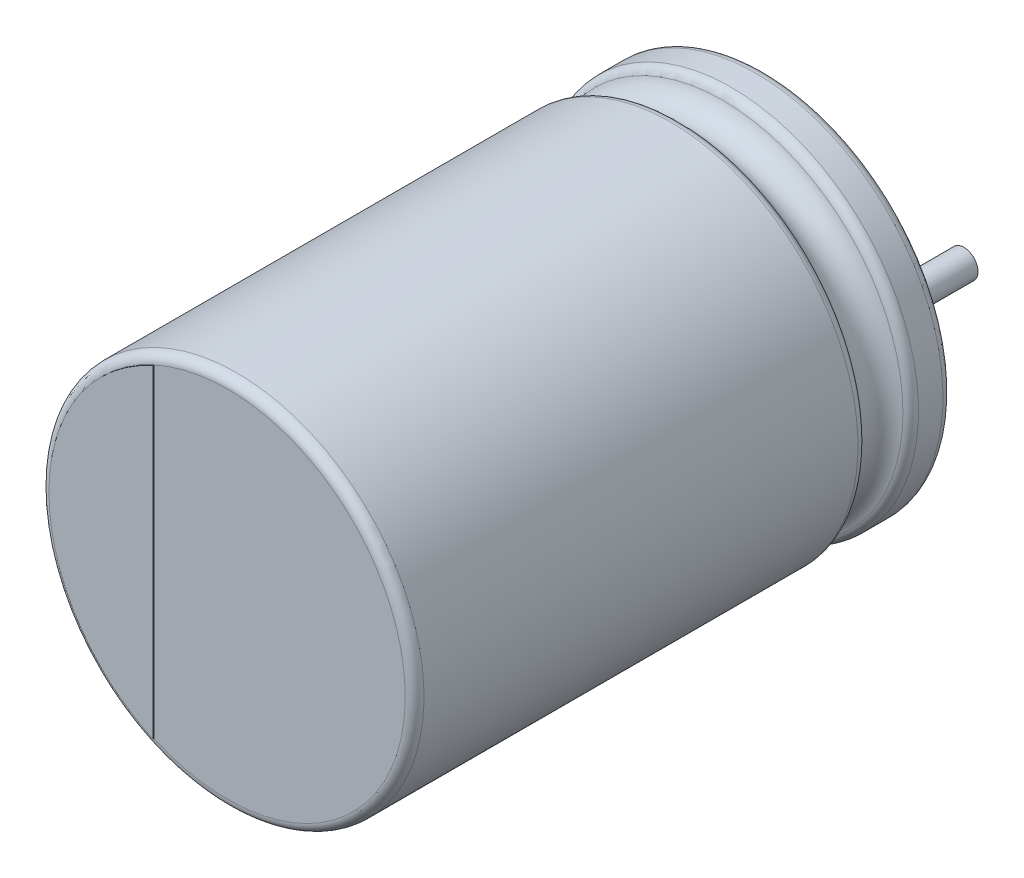
ISO-10303-21;
HEADER;
FILE_DESCRIPTION(('STEP AP214'),'2;1');
FILE_NAME('part.step','',(''),(''),'','','');
FILE_SCHEMA(('AUTOMOTIVE_DESIGN { 1 0 10303 214 1 1 1 1 }'));
ENDSEC;
DATA;
#1=APPLICATION_CONTEXT('core data for automotive mechanical design processes');
#2=APPLICATION_PROTOCOL_DEFINITION('international standard','automotive_design',2000,#1);
#3=PRODUCT_CONTEXT('',#1,'mechanical');
#4=PRODUCT('Part','Part','',(#3));
#5=PRODUCT_RELATED_PRODUCT_CATEGORY('part','',(#4));
#6=PRODUCT_DEFINITION_FORMATION('','',#4);
#7=PRODUCT_DEFINITION_CONTEXT('part definition',#1,'design');
#8=PRODUCT_DEFINITION('design','',#6,#7);
#9=PRODUCT_DEFINITION_SHAPE('','',#8);
#10=(LENGTH_UNIT() NAMED_UNIT(*) SI_UNIT(.MILLI.,.METRE.));
#11=(NAMED_UNIT(*) PLANE_ANGLE_UNIT() SI_UNIT($,.RADIAN.));
#12=(NAMED_UNIT(*) SI_UNIT($,.STERADIAN.) SOLID_ANGLE_UNIT());
#13=UNCERTAINTY_MEASURE_WITH_UNIT(LENGTH_MEASURE(1.E-05),#10,'distance_accuracy_value','');
#14=(GEOMETRIC_REPRESENTATION_CONTEXT(3) GLOBAL_UNCERTAINTY_ASSIGNED_CONTEXT((#13)) GLOBAL_UNIT_ASSIGNED_CONTEXT((#10,
#11,#12)) REPRESENTATION_CONTEXT('',''));
#15=CARTESIAN_POINT('',(0.,0.,0.));
#16=DIRECTION('',(0.,0.,1.));
#17=DIRECTION('',(1.,0.,0.));
#18=AXIS2_PLACEMENT_3D('',#15,#16,#17);
#19=CARTESIAN_POINT('',(-1.75,0.,-2.5));
#20=DIRECTION('',(0.,0.,1.));
#21=DIRECTION('',(1.,0.,0.));
#22=AXIS2_PLACEMENT_3D('',#19,#20,#21);
#23=CYLINDRICAL_SURFACE('',#22,0.3);
#24=CARTESIAN_POINT('',(-1.75,0.,-2.5));
#25=DIRECTION('',(0.,0.,1.));
#26=DIRECTION('',(-1.,0.,0.));
#27=AXIS2_PLACEMENT_3D('',#24,#25,#26);
#28=CIRCLE('',#27,0.3);
#29=CARTESIAN_POINT('',(-2.05,0.,-2.5));
#30=VERTEX_POINT('',#29);
#31=EDGE_CURVE('P0_E10',#30,#30,#28,.T.);
#32=ORIENTED_EDGE('',*,*,#31,.T.);
#33=EDGE_LOOP('',(#32));
#34=FACE_BOUND('',#33,.T.);
#35=CARTESIAN_POINT('',(-1.75,0.,0.));
#36=DIRECTION('',(0.,0.,1.));
#37=DIRECTION('',(-1.,0.,0.));
#38=AXIS2_PLACEMENT_3D('',#35,#36,#37);
#39=CIRCLE('',#38,0.3);
#40=CARTESIAN_POINT('',(-2.05,0.,0.));
#41=VERTEX_POINT('',#40);
#42=EDGE_CURVE('P0_E18',#41,#41,#39,.T.);
#43=ORIENTED_EDGE('',*,*,#42,.F.);
#44=EDGE_LOOP('',(#43));
#45=FACE_BOUND('',#44,.T.);
#46=ADVANCED_FACE('P0_F15',(#34,#45),#23,.T.);
#47=CARTESIAN_POINT('',(-1.75,0.,-2.5));
#48=DIRECTION('',(0.,0.,-1.));
#49=DIRECTION('',(-1.,0.,0.));
#50=AXIS2_PLACEMENT_3D('',#47,#48,#49);
#51=PLANE('',#50);
#52=ORIENTED_EDGE('',*,*,#31,.F.);
#53=EDGE_LOOP('',(#52));
#54=FACE_BOUND('',#53,.T.);
#55=ADVANCED_FACE('P0_F30',(#54),#51,.T.);
#56=CARTESIAN_POINT('',(-1.75,0.,0.));
#57=DIRECTION('',(0.,0.,-1.));
#58=DIRECTION('',(-1.,0.,0.));
#59=AXIS2_PLACEMENT_3D('',#56,#57,#58);
#60=PLANE('',#59);
#61=ORIENTED_EDGE('',*,*,#42,.T.);
#62=EDGE_LOOP('',(#61));
#63=FACE_BOUND('',#62,.T.);
#64=ADVANCED_FACE('P0_F27',(#63),#60,.F.);
#65=CLOSED_SHELL('',(#46,#55,#64));
#66=MANIFOLD_SOLID_BREP('P0_B1',#65);
#67=CARTESIAN_POINT('',(1.75,0.,-2.5));
#68=DIRECTION('',(0.,0.,1.));
#69=DIRECTION('',(1.,0.,0.));
#70=AXIS2_PLACEMENT_3D('',#67,#68,#69);
#71=CYLINDRICAL_SURFACE('',#70,0.300000000000001);
#72=CARTESIAN_POINT('',(1.75,0.,-2.5));
#73=DIRECTION('',(0.,0.,1.));
#74=DIRECTION('',(1.,0.,0.));
#75=AXIS2_PLACEMENT_3D('',#72,#73,#74);
#76=CIRCLE('',#75,0.300000000000001);
#77=CARTESIAN_POINT('',(2.05,0.,-2.5));
#78=VERTEX_POINT('',#77);
#79=EDGE_CURVE('P1_E10',#78,#78,#76,.T.);
#80=ORIENTED_EDGE('',*,*,#79,.T.);
#81=EDGE_LOOP('',(#80));
#82=FACE_BOUND('',#81,.T.);
#83=CARTESIAN_POINT('',(1.75,0.,0.));
#84=DIRECTION('',(0.,0.,1.));
#85=DIRECTION('',(1.,0.,0.));
#86=AXIS2_PLACEMENT_3D('',#83,#84,#85);
#87=CIRCLE('',#86,0.300000000000001);
#88=CARTESIAN_POINT('',(2.05,0.,0.));
#89=VERTEX_POINT('',#88);
#90=EDGE_CURVE('P1_E18',#89,#89,#87,.T.);
#91=ORIENTED_EDGE('',*,*,#90,.F.);
#92=EDGE_LOOP('',(#91));
#93=FACE_BOUND('',#92,.T.);
#94=ADVANCED_FACE('P1_F15',(#82,#93),#71,.T.);
#95=CARTESIAN_POINT('',(1.75,0.,-2.5));
#96=DIRECTION('',(0.,0.,1.));
#97=DIRECTION('',(1.,0.,0.));
#98=AXIS2_PLACEMENT_3D('',#95,#96,#97);
#99=PLANE('',#98);
#100=ORIENTED_EDGE('',*,*,#79,.F.);
#101=EDGE_LOOP('',(#100));
#102=FACE_BOUND('',#101,.T.);
#103=ADVANCED_FACE('P1_F30',(#102),#99,.F.);
#104=CARTESIAN_POINT('',(1.75,0.,0.));
#105=DIRECTION('',(0.,0.,1.));
#106=DIRECTION('',(1.,0.,0.));
#107=AXIS2_PLACEMENT_3D('',#104,#105,#106);
#108=PLANE('',#107);
#109=ORIENTED_EDGE('',*,*,#90,.T.);
#110=EDGE_LOOP('',(#109));
#111=FACE_BOUND('',#110,.T.);
#112=ADVANCED_FACE('P1_F27',(#111),#108,.T.);
#113=CLOSED_SHELL('',(#94,#103,#112));
#114=MANIFOLD_SOLID_BREP('P1_B1',#113);
#115=CARTESIAN_POINT('',(0.,0.,11.5));
#116=DIRECTION('',(0.,0.,1.));
#117=DIRECTION('',(1.,0.,0.));
#118=AXIS2_PLACEMENT_3D('',#115,#116,#117);
#119=PLANE('',#118);
#120=CARTESIAN_POINT('',(0.,0.,11.5));
#121=DIRECTION('',(0.,0.,-1.));
#122=DIRECTION('',(-1.,0.,0.));
#123=AXIS2_PLACEMENT_3D('',#120,#121,#122);
#124=CIRCLE('',#123,3.8);
#125=CARTESIAN_POINT('',(-3.8,0.,11.5));
#126=VERTEX_POINT('',#125);
#127=EDGE_CURVE('P2_E9',#126,#126,#124,.T.);
#128=ORIENTED_EDGE('',*,*,#127,.F.);
#129=EDGE_LOOP('',(#128));
#130=FACE_BOUND('',#129,.T.);
#131=ADVANCED_FACE('P2_F14',(#130),#119,.T.);
#132=CARTESIAN_POINT('',(0.,0.,11.3));
#133=DIRECTION('',(0.,0.,-1.));
#134=DIRECTION('',(-1.,0.,0.));
#135=AXIS2_PLACEMENT_3D('',#132,#133,#134);
#136=TOROIDAL_SURFACE('',#135,3.8,0.2);
#137=ORIENTED_EDGE('',*,*,#127,.T.);
#138=EDGE_LOOP('',(#137));
#139=FACE_BOUND('',#138,.T.);
#140=CARTESIAN_POINT('',(0.,0.,11.3));
#141=DIRECTION('',(0.,0.,-1.));
#142=DIRECTION('',(-1.,0.,0.));
#143=AXIS2_PLACEMENT_3D('',#140,#141,#142);
#144=CIRCLE('',#143,4.);
#145=CARTESIAN_POINT('',(-4.,0.,11.3));
#146=VERTEX_POINT('',#145);
#147=EDGE_CURVE('P2_E20',#146,#146,#144,.T.);
#148=ORIENTED_EDGE('',*,*,#147,.F.);
#149=EDGE_LOOP('',(#148));
#150=FACE_BOUND('',#149,.T.);
#151=ADVANCED_FACE('P2_F65',(#139,#150),#136,.T.);
#152=CARTESIAN_POINT('',(0.,0.,0.));
#153=DIRECTION('',(0.,0.,-1.));
#154=DIRECTION('',(-1.,0.,0.));
#155=AXIS2_PLACEMENT_3D('',#152,#153,#154);
#156=CYLINDRICAL_SURFACE('',#155,4.);
#157=ORIENTED_EDGE('',*,*,#147,.T.);
#158=EDGE_LOOP('',(#157));
#159=FACE_BOUND('',#158,.T.);
#160=CARTESIAN_POINT('',(0.,0.,2.01727304928868));
#161=DIRECTION('',(0.,0.,-1.));
#162=DIRECTION('',(-1.,0.,0.));
#163=AXIS2_PLACEMENT_3D('',#160,#161,#162);
#164=CIRCLE('',#163,4.);
#165=CARTESIAN_POINT('',(-4.,0.,2.01727304928868));
#166=VERTEX_POINT('',#165);
#167=EDGE_CURVE('P2_E24',#166,#166,#164,.T.);
#168=ORIENTED_EDGE('',*,*,#167,.F.);
#169=EDGE_LOOP('',(#168));
#170=FACE_BOUND('',#169,.T.);
#171=ADVANCED_FACE('P2_F71',(#159,#170),#156,.T.);
#172=CARTESIAN_POINT('',(0.,0.,2.01727304928868));
#173=DIRECTION('',(0.,0.,-1.));
#174=DIRECTION('',(-1.,0.,0.));
#175=AXIS2_PLACEMENT_3D('',#172,#173,#174);
#176=TOROIDAL_SURFACE('',#175,3.8,0.200000000000001);
#177=ORIENTED_EDGE('',*,*,#167,.T.);
#178=EDGE_LOOP('',(#177));
#179=FACE_BOUND('',#178,.T.);
#180=CARTESIAN_POINT('',(0.,0.,1.82619677081843));
#181=DIRECTION('',(0.,0.,-1.));
#182=DIRECTION('',(-1.,0.,0.));
#183=AXIS2_PLACEMENT_3D('',#180,#181,#182);
#184=CIRCLE('',#183,3.85907500153159);
#185=CARTESIAN_POINT('',(-3.85907500153159,0.,1.82619677081843));
#186=VERTEX_POINT('',#185);
#187=EDGE_CURVE('P2_E28',#186,#186,#184,.T.);
#188=ORIENTED_EDGE('',*,*,#187,.F.);
#189=EDGE_LOOP('',(#188));
#190=FACE_BOUND('',#189,.T.);
#191=ADVANCED_FACE('P2_F76',(#179,#190),#176,.T.);
#192=CARTESIAN_POINT('',(0.,0.,1.37037919057903));
#193=DIRECTION('',(0.,0.,-1.));
#194=DIRECTION('',(-1.,0.,0.));
#195=AXIS2_PLACEMENT_3D('',#192,#193,#194);
#196=TOROIDAL_SURFACE('',#195,4.,0.477105356969109);
#197=ORIENTED_EDGE('',*,*,#187,.T.);
#198=EDGE_LOOP('',(#197));
#199=FACE_BOUND('',#198,.T.);
#200=CARTESIAN_POINT('',(0.,0.,0.914561610339631));
#201=DIRECTION('',(0.,0.,-1.));
#202=DIRECTION('',(-1.,0.,0.));
#203=AXIS2_PLACEMENT_3D('',#200,#201,#202);
#204=CIRCLE('',#203,3.85907500153159);
#205=CARTESIAN_POINT('',(-3.85907500153159,0.,0.914561610339631));
#206=VERTEX_POINT('',#205);
#207=EDGE_CURVE('P2_E33',#206,#206,#204,.T.);
#208=ORIENTED_EDGE('',*,*,#207,.F.);
#209=EDGE_LOOP('',(#208));
#210=FACE_BOUND('',#209,.T.);
#211=ADVANCED_FACE('P2_F82',(#199,#210),#196,.F.);
#212=CARTESIAN_POINT('',(0.,0.,0.723485331869376));
#213=DIRECTION('',(0.,0.,-1.));
#214=DIRECTION('',(-1.,0.,0.));
#215=AXIS2_PLACEMENT_3D('',#212,#213,#214);
#216=TOROIDAL_SURFACE('',#215,3.8,0.2);
#217=ORIENTED_EDGE('',*,*,#207,.T.);
#218=EDGE_LOOP('',(#217));
#219=FACE_BOUND('',#218,.T.);
#220=CARTESIAN_POINT('',(0.,0.,0.723485331869376));
#221=DIRECTION('',(0.,0.,-1.));
#222=DIRECTION('',(-1.,0.,0.));
#223=AXIS2_PLACEMENT_3D('',#220,#221,#222);
#224=CIRCLE('',#223,4.);
#225=CARTESIAN_POINT('',(-4.,0.,0.723485331869376));
#226=VERTEX_POINT('',#225);
#227=EDGE_CURVE('P2_E36',#226,#226,#224,.T.);
#228=ORIENTED_EDGE('',*,*,#227,.F.);
#229=EDGE_LOOP('',(#228));
#230=FACE_BOUND('',#229,.T.);
#231=ADVANCED_FACE('P2_F61',(#219,#230),#216,.T.);
#232=CARTESIAN_POINT('',(0.,0.,0.));
#233=DIRECTION('',(0.,0.,-1.));
#234=DIRECTION('',(-1.,0.,0.));
#235=AXIS2_PLACEMENT_3D('',#232,#233,#234);
#236=CYLINDRICAL_SURFACE('',#235,4.);
#237=ORIENTED_EDGE('',*,*,#227,.T.);
#238=EDGE_LOOP('',(#237));
#239=FACE_BOUND('',#238,.T.);
#240=CARTESIAN_POINT('',(0.,0.,0.2));
#241=DIRECTION('',(0.,0.,-1.));
#242=DIRECTION('',(-1.,0.,0.));
#243=AXIS2_PLACEMENT_3D('',#240,#241,#242);
#244=CIRCLE('',#243,4.);
#245=CARTESIAN_POINT('',(-4.,0.,0.2));
#246=VERTEX_POINT('',#245);
#247=EDGE_CURVE('P2_E39',#246,#246,#244,.T.);
#248=ORIENTED_EDGE('',*,*,#247,.F.);
#249=EDGE_LOOP('',(#248));
#250=FACE_BOUND('',#249,.T.);
#251=ADVANCED_FACE('P2_F50',(#239,#250),#236,.T.);
#252=CARTESIAN_POINT('',(0.,0.,0.2));
#253=DIRECTION('',(0.,0.,-1.));
#254=DIRECTION('',(-1.,0.,0.));
#255=AXIS2_PLACEMENT_3D('',#252,#253,#254);
#256=TOROIDAL_SURFACE('',#255,3.8,0.2);
#257=ORIENTED_EDGE('',*,*,#247,.T.);
#258=EDGE_LOOP('',(#257));
#259=FACE_BOUND('',#258,.T.);
#260=CARTESIAN_POINT('',(0.,0.,0.));
#261=DIRECTION('',(0.,0.,-1.));
#262=DIRECTION('',(-1.,0.,0.));
#263=AXIS2_PLACEMENT_3D('',#260,#261,#262);
#264=CIRCLE('',#263,3.8);
#265=CARTESIAN_POINT('',(-3.8,0.,0.));
#266=VERTEX_POINT('',#265);
#267=EDGE_CURVE('P2_E42',#266,#266,#264,.T.);
#268=ORIENTED_EDGE('',*,*,#267,.F.);
#269=EDGE_LOOP('',(#268));
#270=FACE_BOUND('',#269,.T.);
#271=ADVANCED_FACE('P2_F48',(#259,#270),#256,.T.);
#272=CARTESIAN_POINT('',(0.,0.,0.));
#273=DIRECTION('',(0.,0.,-1.));
#274=DIRECTION('',(-1.,0.,0.));
#275=AXIS2_PLACEMENT_3D('',#272,#273,#274);
#276=PLANE('',#275);
#277=ORIENTED_EDGE('',*,*,#267,.T.);
#278=EDGE_LOOP('',(#277));
#279=FACE_BOUND('',#278,.T.);
#280=ADVANCED_FACE('P2_F46',(#279),#276,.T.);
#281=CLOSED_SHELL('',(#131,#151,#171,#191,#211,#231,#251,#271,#280));
#282=MANIFOLD_SOLID_BREP('P2_B1',#281);
#283=CARTESIAN_POINT('',(0.,0.,11.52));
#284=DIRECTION('',(0.,0.,-1.));
#285=DIRECTION('',(-1.,0.,0.));
#286=AXIS2_PLACEMENT_3D('',#283,#284,#285);
#287=CYLINDRICAL_SURFACE('',#286,3.8);
#288=CARTESIAN_POINT('',(0.,0.,11.5));
#289=DIRECTION('',(0.,0.,1.));
#290=DIRECTION('',(1.,0.,0.));
#291=AXIS2_PLACEMENT_3D('',#288,#289,#290);
#292=CIRCLE('',#291,3.8);
#293=CARTESIAN_POINT('',(-1.57464786851673,3.45839328159418,11.5));
#294=VERTEX_POINT('',#293);
#295=CARTESIAN_POINT('',(-1.57464786851673,-3.45839328159418,11.5));
#296=VERTEX_POINT('',#295);
#297=EDGE_CURVE('P3_E47',#294,#296,#292,.T.);
#298=ORIENTED_EDGE('',*,*,#297,.T.);
#299=DIRECTION('',(0.,0.,-1.));
#300=VECTOR('',#299,1.);
#301=CARTESIAN_POINT('',(-1.57464786851673,-3.45839328159418,11.52));
#302=LINE('',#301,#300);
#303=CARTESIAN_POINT('',(-1.57464786851673,-3.45839328159418,11.52));
#304=VERTEX_POINT('',#303);
#305=EDGE_CURVE('P3_E10',#304,#296,#302,.T.);
#306=ORIENTED_EDGE('',*,*,#305,.F.);
#307=CARTESIAN_POINT('',(0.,0.,11.52));
#308=DIRECTION('',(0.,0.,1.));
#309=DIRECTION('',(1.,0.,0.));
#310=AXIS2_PLACEMENT_3D('',#307,#308,#309);
#311=CIRCLE('',#310,3.8);
#312=CARTESIAN_POINT('',(-1.57464786851673,3.45839328159418,11.52));
#313=VERTEX_POINT('',#312);
#314=EDGE_CURVE('P3_E46',#313,#304,#311,.T.);
#315=ORIENTED_EDGE('',*,*,#314,.F.);
#316=DIRECTION('',(0.,0.,-1.));
#317=VECTOR('',#316,1.);
#318=CARTESIAN_POINT('',(-1.57464786851673,3.45839328159418,11.52));
#319=LINE('',#318,#317);
#320=EDGE_CURVE('P3_E24',#313,#294,#319,.T.);
#321=ORIENTED_EDGE('',*,*,#320,.T.);
#322=EDGE_LOOP('',(#298,#306,#315,#321));
#323=FACE_BOUND('',#322,.T.);
#324=ADVANCED_FACE('P3_F16',(#323),#287,.T.);
#325=CARTESIAN_POINT('',(-1.57464786851673,3.45839328159418,11.52));
#326=DIRECTION('',(-1.,0.,0.));
#327=DIRECTION('',(0.,0.,1.));
#328=AXIS2_PLACEMENT_3D('',#325,#326,#327);
#329=PLANE('',#328);
#330=DIRECTION('',(0.,1.,0.));
#331=VECTOR('',#330,1.);
#332=CARTESIAN_POINT('',(-1.57464786851673,3.45839328159418,11.5));
#333=LINE('',#332,#331);
#334=EDGE_CURVE('P3_E39',#296,#294,#333,.T.);
#335=ORIENTED_EDGE('',*,*,#334,.T.);
#336=ORIENTED_EDGE('',*,*,#320,.F.);
#337=DIRECTION('',(0.,1.,0.));
#338=VECTOR('',#337,1.);
#339=CARTESIAN_POINT('',(-1.57464786851673,3.45839328159418,11.52));
#340=LINE('',#339,#338);
#341=EDGE_CURVE('P3_E31',#304,#313,#340,.T.);
#342=ORIENTED_EDGE('',*,*,#341,.F.);
#343=ORIENTED_EDGE('',*,*,#305,.T.);
#344=EDGE_LOOP('',(#335,#336,#342,#343));
#345=FACE_BOUND('',#344,.T.);
#346=ADVANCED_FACE('P3_F42',(#345),#329,.F.);
#347=CARTESIAN_POINT('',(0.,0.,11.52));
#348=DIRECTION('',(0.,0.,1.));
#349=DIRECTION('',(1.,0.,0.));
#350=AXIS2_PLACEMENT_3D('',#347,#348,#349);
#351=PLANE('',#350);
#352=ORIENTED_EDGE('',*,*,#314,.T.);
#353=ORIENTED_EDGE('',*,*,#341,.T.);
#354=EDGE_LOOP('',(#352,#353));
#355=FACE_BOUND('',#354,.T.);
#356=ADVANCED_FACE('P3_F54',(#355),#351,.T.);
#357=CARTESIAN_POINT('',(0.,0.,11.5));
#358=DIRECTION('',(0.,0.,1.));
#359=DIRECTION('',(1.,0.,0.));
#360=AXIS2_PLACEMENT_3D('',#357,#358,#359);
#361=PLANE('',#360);
#362=ORIENTED_EDGE('',*,*,#297,.F.);
#363=ORIENTED_EDGE('',*,*,#334,.F.);
#364=EDGE_LOOP('',(#362,#363));
#365=FACE_BOUND('',#364,.T.);
#366=ADVANCED_FACE('P3_F50',(#365),#361,.F.);
#367=CLOSED_SHELL('',(#324,#346,#356,#366));
#368=MANIFOLD_SOLID_BREP('P3_B1',#367);
#369=ADVANCED_BREP_SHAPE_REPRESENTATION('',(#18,#66,#114,#282,#368),#14);
#370=SHAPE_DEFINITION_REPRESENTATION(#9,#369);
ENDSEC;
END-ISO-10303-21;
